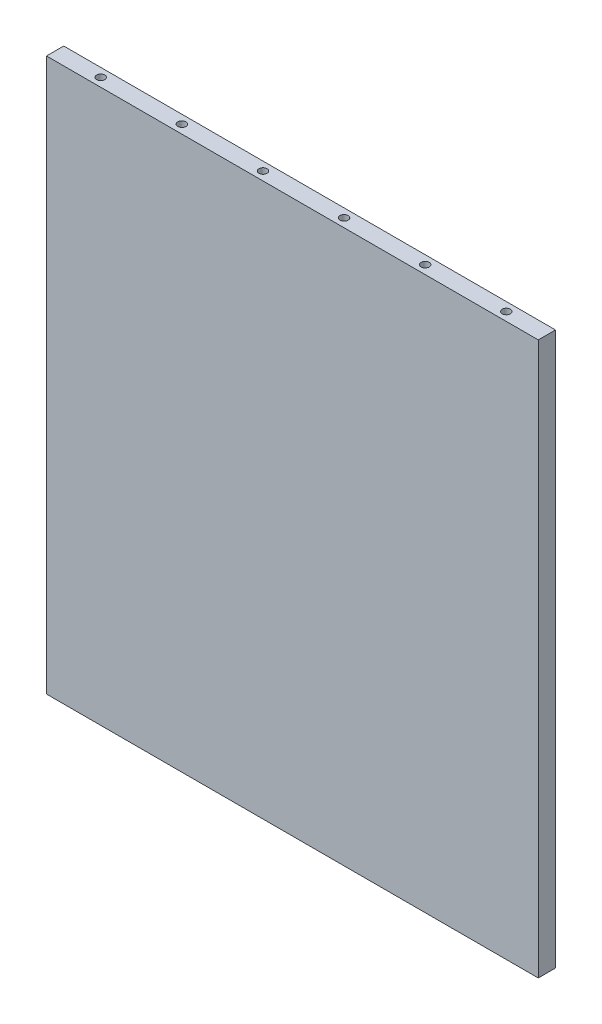
ISO-10303-21;
HEADER;
FILE_DESCRIPTION(('STEP AP214'),'2;1');
FILE_NAME('part.step','',(''),(''),'','','');
FILE_SCHEMA(('AUTOMOTIVE_DESIGN { 1 0 10303 214 1 1 1 1 }'));
ENDSEC;
DATA;
#1=APPLICATION_CONTEXT('core data for automotive mechanical design processes');
#2=APPLICATION_PROTOCOL_DEFINITION('international standard','automotive_design',2000,#1);
#3=PRODUCT_CONTEXT('',#1,'mechanical');
#4=PRODUCT('Part','Part','',(#3));
#5=PRODUCT_RELATED_PRODUCT_CATEGORY('part','',(#4));
#6=PRODUCT_DEFINITION_FORMATION('','',#4);
#7=PRODUCT_DEFINITION_CONTEXT('part definition',#1,'design');
#8=PRODUCT_DEFINITION('design','',#6,#7);
#9=PRODUCT_DEFINITION_SHAPE('','',#8);
#10=(LENGTH_UNIT() NAMED_UNIT(*) SI_UNIT(.MILLI.,.METRE.));
#11=(NAMED_UNIT(*) PLANE_ANGLE_UNIT() SI_UNIT($,.RADIAN.));
#12=(NAMED_UNIT(*) SI_UNIT($,.STERADIAN.) SOLID_ANGLE_UNIT());
#13=UNCERTAINTY_MEASURE_WITH_UNIT(LENGTH_MEASURE(1.E-05),#10,'distance_accuracy_value','');
#14=(GEOMETRIC_REPRESENTATION_CONTEXT(3) GLOBAL_UNCERTAINTY_ASSIGNED_CONTEXT((#13)) GLOBAL_UNIT_ASSIGNED_CONTEXT((#10,
#11,#12)) REPRESENTATION_CONTEXT('',''));
#15=CARTESIAN_POINT('',(0.,0.,0.));
#16=DIRECTION('',(0.,0.,1.));
#17=DIRECTION('',(1.,0.,0.));
#18=AXIS2_PLACEMENT_3D('',#15,#16,#17);
#19=CARTESIAN_POINT('',(-230.,-28.,17.));
#20=DIRECTION('',(0.,-1.,0.));
#21=DIRECTION('',(0.,0.,-1.));
#22=AXIS2_PLACEMENT_3D('',#19,#20,#21);
#23=PLANE('',#22);
#24=CARTESIAN_POINT('',(-105.,-28.,8.50000000000006));
#25=DIRECTION('',(0.,-1.,0.));
#26=DIRECTION('',(0.,0.,-1.));
#27=AXIS2_PLACEMENT_3D('',#24,#25,#26);
#28=CIRCLE('',#27,3.99999999999999);
#29=CARTESIAN_POINT('',(-105.,-28.,4.50000000000007));
#30=VERTEX_POINT('',#29);
#31=EDGE_CURVE('E123',#30,#30,#28,.F.);
#32=ORIENTED_EDGE('',*,*,#31,.F.);
#33=EDGE_LOOP('',(#32));
#34=FACE_BOUND('',#33,.T.);
#35=CARTESIAN_POINT('',(55.0000000000001,-28.,8.50000000000006));
#36=DIRECTION('',(0.,-1.,0.));
#37=DIRECTION('',(0.,0.,-1.));
#38=AXIS2_PLACEMENT_3D('',#35,#36,#37);
#39=CIRCLE('',#38,3.99999999999999);
#40=CARTESIAN_POINT('',(55.0000000000001,-28.,4.50000000000007));
#41=VERTEX_POINT('',#40);
#42=EDGE_CURVE('E116',#41,#41,#39,.F.);
#43=ORIENTED_EDGE('',*,*,#42,.F.);
#44=EDGE_LOOP('',(#43));
#45=FACE_BOUND('',#44,.T.);
#46=CARTESIAN_POINT('',(215.,-28.,8.50000000000006));
#47=DIRECTION('',(0.,-1.,0.));
#48=DIRECTION('',(0.,0.,-1.));
#49=AXIS2_PLACEMENT_3D('',#46,#47,#48);
#50=CIRCLE('',#49,3.99999999999999);
#51=CARTESIAN_POINT('',(215.,-28.,4.50000000000007));
#52=VERTEX_POINT('',#51);
#53=EDGE_CURVE('E103',#52,#52,#50,.F.);
#54=ORIENTED_EDGE('',*,*,#53,.F.);
#55=EDGE_LOOP('',(#54));
#56=FACE_BOUND('',#55,.T.);
#57=DIRECTION('',(-1.,0.,0.));
#58=VECTOR('',#57,1.);
#59=CARTESIAN_POINT('',(-230.,-28.,0.));
#60=LINE('',#59,#58);
#61=CARTESIAN_POINT('',(255.,-28.,0.));
#62=VERTEX_POINT('',#61);
#63=CARTESIAN_POINT('',(-230.,-28.,0.));
#64=VERTEX_POINT('',#63);
#65=EDGE_CURVE('E69',#62,#64,#60,.T.);
#66=ORIENTED_EDGE('',*,*,#65,.T.);
#67=DIRECTION('',(0.,0.,-1.));
#68=VECTOR('',#67,1.);
#69=CARTESIAN_POINT('',(-230.,-28.,17.));
#70=LINE('',#69,#68);
#71=CARTESIAN_POINT('',(-230.,-28.,17.));
#72=VERTEX_POINT('',#71);
#73=EDGE_CURVE('E92',#72,#64,#70,.T.);
#74=ORIENTED_EDGE('',*,*,#73,.F.);
#75=DIRECTION('',(-1.,0.,0.));
#76=VECTOR('',#75,1.);
#77=CARTESIAN_POINT('',(-230.,-28.,17.));
#78=LINE('',#77,#76);
#79=CARTESIAN_POINT('',(255.,-28.,17.));
#80=VERTEX_POINT('',#79);
#81=EDGE_CURVE('E85',#80,#72,#78,.T.);
#82=ORIENTED_EDGE('',*,*,#81,.F.);
#83=DIRECTION('',(0.,0.,-1.));
#84=VECTOR('',#83,1.);
#85=CARTESIAN_POINT('',(255.,-28.,17.));
#86=LINE('',#85,#84);
#87=EDGE_CURVE('E43',#80,#62,#86,.T.);
#88=ORIENTED_EDGE('',*,*,#87,.T.);
#89=EDGE_LOOP('',(#66,#74,#82,#88));
#90=FACE_BOUND('',#89,.T.);
#91=CARTESIAN_POINT('',(135.,-28.,8.50000000000006));
#92=DIRECTION('',(0.,-1.,0.));
#93=DIRECTION('',(0.,0.,-1.));
#94=AXIS2_PLACEMENT_3D('',#91,#92,#93);
#95=CIRCLE('',#94,3.99999999999999);
#96=CARTESIAN_POINT('',(135.,-28.,4.50000000000007));
#97=VERTEX_POINT('',#96);
#98=EDGE_CURVE('E112',#97,#97,#95,.F.);
#99=ORIENTED_EDGE('',*,*,#98,.F.);
#100=EDGE_LOOP('',(#99));
#101=FACE_BOUND('',#100,.T.);
#102=CARTESIAN_POINT('',(-24.9999999999999,-28.,8.50000000000006));
#103=DIRECTION('',(0.,-1.,0.));
#104=DIRECTION('',(0.,0.,-1.));
#105=AXIS2_PLACEMENT_3D('',#102,#103,#104);
#106=CIRCLE('',#105,3.99999999999999);
#107=CARTESIAN_POINT('',(-24.9999999999999,-28.,4.50000000000007));
#108=VERTEX_POINT('',#107);
#109=EDGE_CURVE('E120',#108,#108,#106,.F.);
#110=ORIENTED_EDGE('',*,*,#109,.F.);
#111=EDGE_LOOP('',(#110));
#112=FACE_BOUND('',#111,.T.);
#113=CARTESIAN_POINT('',(-185.,-28.,8.50000000000006));
#114=DIRECTION('',(0.,-1.,0.));
#115=DIRECTION('',(0.,0.,-1.));
#116=AXIS2_PLACEMENT_3D('',#113,#114,#115);
#117=CIRCLE('',#116,3.99999999999999);
#118=CARTESIAN_POINT('',(-185.,-28.,4.50000000000007));
#119=VERTEX_POINT('',#118);
#120=EDGE_CURVE('E37',#119,#119,#117,.F.);
#121=ORIENTED_EDGE('',*,*,#120,.F.);
#122=EDGE_LOOP('',(#121));
#123=FACE_BOUND('',#122,.T.);
#124=ADVANCED_FACE('F33',(#34,#45,#56,#90,#101,#112,#123),#23,.F.);
#125=CARTESIAN_POINT('',(-230.,-573.,17.));
#126=DIRECTION('',(0.,1.,0.));
#127=DIRECTION('',(0.,0.,1.));
#128=AXIS2_PLACEMENT_3D('',#125,#126,#127);
#129=PLANE('',#128);
#130=DIRECTION('',(1.,0.,0.));
#131=VECTOR('',#130,1.);
#132=CARTESIAN_POINT('',(-230.,-573.,0.));
#133=LINE('',#132,#131);
#134=CARTESIAN_POINT('',(-230.,-573.,0.));
#135=VERTEX_POINT('',#134);
#136=CARTESIAN_POINT('',(255.,-573.,0.));
#137=VERTEX_POINT('',#136);
#138=EDGE_CURVE('E100',#135,#137,#133,.T.);
#139=ORIENTED_EDGE('',*,*,#138,.T.);
#140=DIRECTION('',(0.,0.,-1.));
#141=VECTOR('',#140,1.);
#142=CARTESIAN_POINT('',(255.,-573.,17.));
#143=LINE('',#142,#141);
#144=CARTESIAN_POINT('',(255.,-573.,17.));
#145=VERTEX_POINT('',#144);
#146=EDGE_CURVE('E11',#145,#137,#143,.T.);
#147=ORIENTED_EDGE('',*,*,#146,.F.);
#148=DIRECTION('',(1.,0.,0.));
#149=VECTOR('',#148,1.);
#150=CARTESIAN_POINT('',(-230.,-573.,17.));
#151=LINE('',#150,#149);
#152=CARTESIAN_POINT('',(-230.,-573.,17.));
#153=VERTEX_POINT('',#152);
#154=EDGE_CURVE('E87',#153,#145,#151,.T.);
#155=ORIENTED_EDGE('',*,*,#154,.F.);
#156=DIRECTION('',(0.,0.,-1.));
#157=VECTOR('',#156,1.);
#158=CARTESIAN_POINT('',(-230.,-573.,17.));
#159=LINE('',#158,#157);
#160=EDGE_CURVE('E96',#153,#135,#159,.T.);
#161=ORIENTED_EDGE('',*,*,#160,.T.);
#162=EDGE_LOOP('',(#139,#147,#155,#161));
#163=FACE_BOUND('',#162,.T.);
#164=ADVANCED_FACE('F35',(#163),#129,.F.);
#165=CARTESIAN_POINT('',(255.,-573.,17.));
#166=DIRECTION('',(-1.,0.,0.));
#167=DIRECTION('',(0.,0.,1.));
#168=AXIS2_PLACEMENT_3D('',#165,#166,#167);
#169=PLANE('',#168);
#170=DIRECTION('',(0.,1.,0.));
#171=VECTOR('',#170,1.);
#172=CARTESIAN_POINT('',(255.,-573.,0.));
#173=LINE('',#172,#171);
#174=EDGE_CURVE('E91',#137,#62,#173,.T.);
#175=ORIENTED_EDGE('',*,*,#174,.T.);
#176=ORIENTED_EDGE('',*,*,#87,.F.);
#177=DIRECTION('',(0.,1.,0.));
#178=VECTOR('',#177,1.);
#179=CARTESIAN_POINT('',(255.,-573.,17.));
#180=LINE('',#179,#178);
#181=EDGE_CURVE('E82',#145,#80,#180,.T.);
#182=ORIENTED_EDGE('',*,*,#181,.F.);
#183=ORIENTED_EDGE('',*,*,#146,.T.);
#184=EDGE_LOOP('',(#175,#176,#182,#183));
#185=FACE_BOUND('',#184,.T.);
#186=ADVANCED_FACE('F90',(#185),#169,.F.);
#187=CARTESIAN_POINT('',(-230.,-573.,17.));
#188=DIRECTION('',(1.,0.,0.));
#189=DIRECTION('',(0.,0.,-1.));
#190=AXIS2_PLACEMENT_3D('',#187,#188,#189);
#191=PLANE('',#190);
#192=DIRECTION('',(0.,-1.,0.));
#193=VECTOR('',#192,1.);
#194=CARTESIAN_POINT('',(-230.,-573.,0.));
#195=LINE('',#194,#193);
#196=EDGE_CURVE('E75',#64,#135,#195,.T.);
#197=ORIENTED_EDGE('',*,*,#196,.T.);
#198=ORIENTED_EDGE('',*,*,#160,.F.);
#199=DIRECTION('',(0.,-1.,0.));
#200=VECTOR('',#199,1.);
#201=CARTESIAN_POINT('',(-230.,-573.,17.));
#202=LINE('',#201,#200);
#203=EDGE_CURVE('E52',#72,#153,#202,.T.);
#204=ORIENTED_EDGE('',*,*,#203,.F.);
#205=ORIENTED_EDGE('',*,*,#73,.T.);
#206=EDGE_LOOP('',(#197,#198,#204,#205));
#207=FACE_BOUND('',#206,.T.);
#208=ADVANCED_FACE('F170',(#207),#191,.F.);
#209=CARTESIAN_POINT('',(0.,0.,17.));
#210=DIRECTION('',(0.,0.,1.));
#211=DIRECTION('',(1.,0.,0.));
#212=AXIS2_PLACEMENT_3D('',#209,#210,#211);
#213=PLANE('',#212);
#214=ORIENTED_EDGE('',*,*,#154,.T.);
#215=ORIENTED_EDGE('',*,*,#181,.T.);
#216=ORIENTED_EDGE('',*,*,#81,.T.);
#217=ORIENTED_EDGE('',*,*,#203,.T.);
#218=EDGE_LOOP('',(#214,#215,#216,#217));
#219=FACE_BOUND('',#218,.T.);
#220=ADVANCED_FACE('F83',(#219),#213,.T.);
#221=CARTESIAN_POINT('',(0.,0.,0.));
#222=DIRECTION('',(0.,0.,1.));
#223=DIRECTION('',(1.,0.,0.));
#224=AXIS2_PLACEMENT_3D('',#221,#222,#223);
#225=PLANE('',#224);
#226=ORIENTED_EDGE('',*,*,#138,.F.);
#227=ORIENTED_EDGE('',*,*,#196,.F.);
#228=ORIENTED_EDGE('',*,*,#65,.F.);
#229=ORIENTED_EDGE('',*,*,#174,.F.);
#230=EDGE_LOOP('',(#226,#227,#228,#229));
#231=FACE_BOUND('',#230,.T.);
#232=ADVANCED_FACE('F159',(#231),#225,.F.);
#233=CARTESIAN_POINT('',(215.,-52.1395040960036,8.50000000000006));
#234=DIRECTION('',(0.,1.,0.));
#235=DIRECTION('',(0.,0.,1.));
#236=AXIS2_PLACEMENT_3D('',#233,#234,#235);
#237=CYLINDRICAL_SURFACE('',#236,3.99999999999999);
#238=CARTESIAN_POINT('',(215.,-52.1395040960036,8.50000000000006));
#239=DIRECTION('',(0.,-1.,0.));
#240=DIRECTION('',(0.,0.,-1.));
#241=AXIS2_PLACEMENT_3D('',#238,#239,#240);
#242=CIRCLE('',#241,3.99999999999999);
#243=CARTESIAN_POINT('',(215.,-52.1395040960036,4.50000000000007));
#244=VERTEX_POINT('',#243);
#245=EDGE_CURVE('E111',#244,#244,#242,.T.);
#246=ORIENTED_EDGE('',*,*,#245,.T.);
#247=EDGE_LOOP('',(#246));
#248=FACE_BOUND('',#247,.T.);
#249=ORIENTED_EDGE('',*,*,#53,.T.);
#250=EDGE_LOOP('',(#249));
#251=FACE_BOUND('',#250,.T.);
#252=ADVANCED_FACE('F145',(#248,#251),#237,.F.);
#253=CARTESIAN_POINT('',(215.,-52.1395040960036,8.50000000000006));
#254=DIRECTION('',(0.,-1.,0.));
#255=DIRECTION('',(0.,0.,-1.));
#256=AXIS2_PLACEMENT_3D('',#253,#254,#255);
#257=PLANE('',#256);
#258=ORIENTED_EDGE('',*,*,#245,.F.);
#259=EDGE_LOOP('',(#258));
#260=FACE_BOUND('',#259,.T.);
#261=ADVANCED_FACE('F148',(#260),#257,.F.);
#262=CARTESIAN_POINT('',(135.,-52.1395040960036,8.50000000000006));
#263=DIRECTION('',(0.,1.,0.));
#264=DIRECTION('',(0.,0.,1.));
#265=AXIS2_PLACEMENT_3D('',#262,#263,#264);
#266=CYLINDRICAL_SURFACE('',#265,3.99999999999999);
#267=CARTESIAN_POINT('',(135.,-52.1395040960036,8.50000000000006));
#268=DIRECTION('',(0.,-1.,0.));
#269=DIRECTION('',(0.,0.,-1.));
#270=AXIS2_PLACEMENT_3D('',#267,#268,#269);
#271=CIRCLE('',#270,3.99999999999999);
#272=CARTESIAN_POINT('',(135.,-52.1395040960036,4.50000000000007));
#273=VERTEX_POINT('',#272);
#274=EDGE_CURVE('E115',#273,#273,#271,.T.);
#275=ORIENTED_EDGE('',*,*,#274,.T.);
#276=EDGE_LOOP('',(#275));
#277=FACE_BOUND('',#276,.T.);
#278=ORIENTED_EDGE('',*,*,#98,.T.);
#279=EDGE_LOOP('',(#278));
#280=FACE_BOUND('',#279,.T.);
#281=ADVANCED_FACE('F150',(#277,#280),#266,.F.);
#282=CARTESIAN_POINT('',(135.,-52.1395040960036,8.50000000000006));
#283=DIRECTION('',(0.,-1.,0.));
#284=DIRECTION('',(0.,0.,-1.));
#285=AXIS2_PLACEMENT_3D('',#282,#283,#284);
#286=PLANE('',#285);
#287=ORIENTED_EDGE('',*,*,#274,.F.);
#288=EDGE_LOOP('',(#287));
#289=FACE_BOUND('',#288,.T.);
#290=ADVANCED_FACE('F156',(#289),#286,.F.);
#291=CARTESIAN_POINT('',(55.0000000000001,-52.1395040960036,8.50000000000006));
#292=DIRECTION('',(0.,1.,0.));
#293=DIRECTION('',(0.,0.,1.));
#294=AXIS2_PLACEMENT_3D('',#291,#292,#293);
#295=CYLINDRICAL_SURFACE('',#294,3.99999999999999);
#296=CARTESIAN_POINT('',(55.0000000000001,-52.1395040960036,8.50000000000006));
#297=DIRECTION('',(0.,-1.,0.));
#298=DIRECTION('',(0.,0.,-1.));
#299=AXIS2_PLACEMENT_3D('',#296,#297,#298);
#300=CIRCLE('',#299,3.99999999999999);
#301=CARTESIAN_POINT('',(55.0000000000001,-52.1395040960036,4.50000000000007));
#302=VERTEX_POINT('',#301);
#303=EDGE_CURVE('E119',#302,#302,#300,.T.);
#304=ORIENTED_EDGE('',*,*,#303,.T.);
#305=EDGE_LOOP('',(#304));
#306=FACE_BOUND('',#305,.T.);
#307=ORIENTED_EDGE('',*,*,#42,.T.);
#308=EDGE_LOOP('',(#307));
#309=FACE_BOUND('',#308,.T.);
#310=ADVANCED_FACE('F212',(#306,#309),#295,.F.);
#311=CARTESIAN_POINT('',(55.0000000000001,-52.1395040960036,8.50000000000006));
#312=DIRECTION('',(0.,-1.,0.));
#313=DIRECTION('',(0.,0.,-1.));
#314=AXIS2_PLACEMENT_3D('',#311,#312,#313);
#315=PLANE('',#314);
#316=ORIENTED_EDGE('',*,*,#303,.F.);
#317=EDGE_LOOP('',(#316));
#318=FACE_BOUND('',#317,.T.);
#319=ADVANCED_FACE('F222',(#318),#315,.F.);
#320=CARTESIAN_POINT('',(-24.9999999999999,-52.1395040960036,8.50000000000006));
#321=DIRECTION('',(0.,1.,0.));
#322=DIRECTION('',(0.,0.,1.));
#323=AXIS2_PLACEMENT_3D('',#320,#321,#322);
#324=CYLINDRICAL_SURFACE('',#323,3.99999999999999);
#325=CARTESIAN_POINT('',(-24.9999999999999,-52.1395040960036,8.50000000000006));
#326=DIRECTION('',(0.,-1.,0.));
#327=DIRECTION('',(0.,0.,-1.));
#328=AXIS2_PLACEMENT_3D('',#325,#326,#327);
#329=CIRCLE('',#328,3.99999999999999);
#330=CARTESIAN_POINT('',(-24.9999999999999,-52.1395040960036,4.50000000000007));
#331=VERTEX_POINT('',#330);
#332=EDGE_CURVE('E122',#331,#331,#329,.T.);
#333=ORIENTED_EDGE('',*,*,#332,.T.);
#334=EDGE_LOOP('',(#333));
#335=FACE_BOUND('',#334,.T.);
#336=ORIENTED_EDGE('',*,*,#109,.T.);
#337=EDGE_LOOP('',(#336));
#338=FACE_BOUND('',#337,.T.);
#339=ADVANCED_FACE('F232',(#335,#338),#324,.F.);
#340=CARTESIAN_POINT('',(-24.9999999999999,-52.1395040960036,8.50000000000006));
#341=DIRECTION('',(0.,-1.,0.));
#342=DIRECTION('',(0.,0.,-1.));
#343=AXIS2_PLACEMENT_3D('',#340,#341,#342);
#344=PLANE('',#343);
#345=ORIENTED_EDGE('',*,*,#332,.F.);
#346=EDGE_LOOP('',(#345));
#347=FACE_BOUND('',#346,.T.);
#348=ADVANCED_FACE('F242',(#347),#344,.F.);
#349=CARTESIAN_POINT('',(-105.,-52.1395040960036,8.50000000000006));
#350=DIRECTION('',(0.,1.,0.));
#351=DIRECTION('',(0.,0.,1.));
#352=AXIS2_PLACEMENT_3D('',#349,#350,#351);
#353=CYLINDRICAL_SURFACE('',#352,3.99999999999999);
#354=CARTESIAN_POINT('',(-105.,-52.1395040960036,8.50000000000006));
#355=DIRECTION('',(0.,-1.,0.));
#356=DIRECTION('',(0.,0.,-1.));
#357=AXIS2_PLACEMENT_3D('',#354,#355,#356);
#358=CIRCLE('',#357,3.99999999999999);
#359=CARTESIAN_POINT('',(-105.,-52.1395040960036,4.50000000000007));
#360=VERTEX_POINT('',#359);
#361=EDGE_CURVE('E125',#360,#360,#358,.T.);
#362=ORIENTED_EDGE('',*,*,#361,.T.);
#363=EDGE_LOOP('',(#362));
#364=FACE_BOUND('',#363,.T.);
#365=ORIENTED_EDGE('',*,*,#31,.T.);
#366=EDGE_LOOP('',(#365));
#367=FACE_BOUND('',#366,.T.);
#368=ADVANCED_FACE('F252',(#364,#367),#353,.F.);
#369=CARTESIAN_POINT('',(-105.,-52.1395040960036,8.50000000000006));
#370=DIRECTION('',(0.,-1.,0.));
#371=DIRECTION('',(0.,0.,-1.));
#372=AXIS2_PLACEMENT_3D('',#369,#370,#371);
#373=PLANE('',#372);
#374=ORIENTED_EDGE('',*,*,#361,.F.);
#375=EDGE_LOOP('',(#374));
#376=FACE_BOUND('',#375,.T.);
#377=ADVANCED_FACE('F262',(#376),#373,.F.);
#378=CARTESIAN_POINT('',(-185.,-52.1395040960036,8.50000000000006));
#379=DIRECTION('',(0.,1.,0.));
#380=DIRECTION('',(0.,0.,1.));
#381=AXIS2_PLACEMENT_3D('',#378,#379,#380);
#382=CYLINDRICAL_SURFACE('',#381,3.99999999999999);
#383=CARTESIAN_POINT('',(-185.,-52.1395040960036,8.50000000000006));
#384=DIRECTION('',(0.,-1.,0.));
#385=DIRECTION('',(0.,0.,-1.));
#386=AXIS2_PLACEMENT_3D('',#383,#384,#385);
#387=CIRCLE('',#386,3.99999999999999);
#388=CARTESIAN_POINT('',(-185.,-52.1395040960036,4.50000000000007));
#389=VERTEX_POINT('',#388);
#390=EDGE_CURVE('E135',#389,#389,#387,.T.);
#391=ORIENTED_EDGE('',*,*,#390,.T.);
#392=EDGE_LOOP('',(#391));
#393=FACE_BOUND('',#392,.T.);
#394=ORIENTED_EDGE('',*,*,#120,.T.);
#395=EDGE_LOOP('',(#394));
#396=FACE_BOUND('',#395,.T.);
#397=ADVANCED_FACE('F271',(#393,#396),#382,.F.);
#398=CARTESIAN_POINT('',(-185.,-52.1395040960036,8.50000000000006));
#399=DIRECTION('',(0.,-1.,0.));
#400=DIRECTION('',(0.,0.,-1.));
#401=AXIS2_PLACEMENT_3D('',#398,#399,#400);
#402=PLANE('',#401);
#403=ORIENTED_EDGE('',*,*,#390,.F.);
#404=EDGE_LOOP('',(#403));
#405=FACE_BOUND('',#404,.T.);
#406=ADVANCED_FACE('F281',(#405),#402,.F.);
#407=CLOSED_SHELL('',(#124,#164,#186,#208,#220,#232,#252,#261,#281,#290,#310,#319,#339,#348,
#368,#377,#397,#406));
#408=MANIFOLD_SOLID_BREP('B2',#407);
#409=ADVANCED_BREP_SHAPE_REPRESENTATION('',(#18,#408),#14);
#410=SHAPE_DEFINITION_REPRESENTATION(#9,#409);
ENDSEC;
END-ISO-10303-21;
